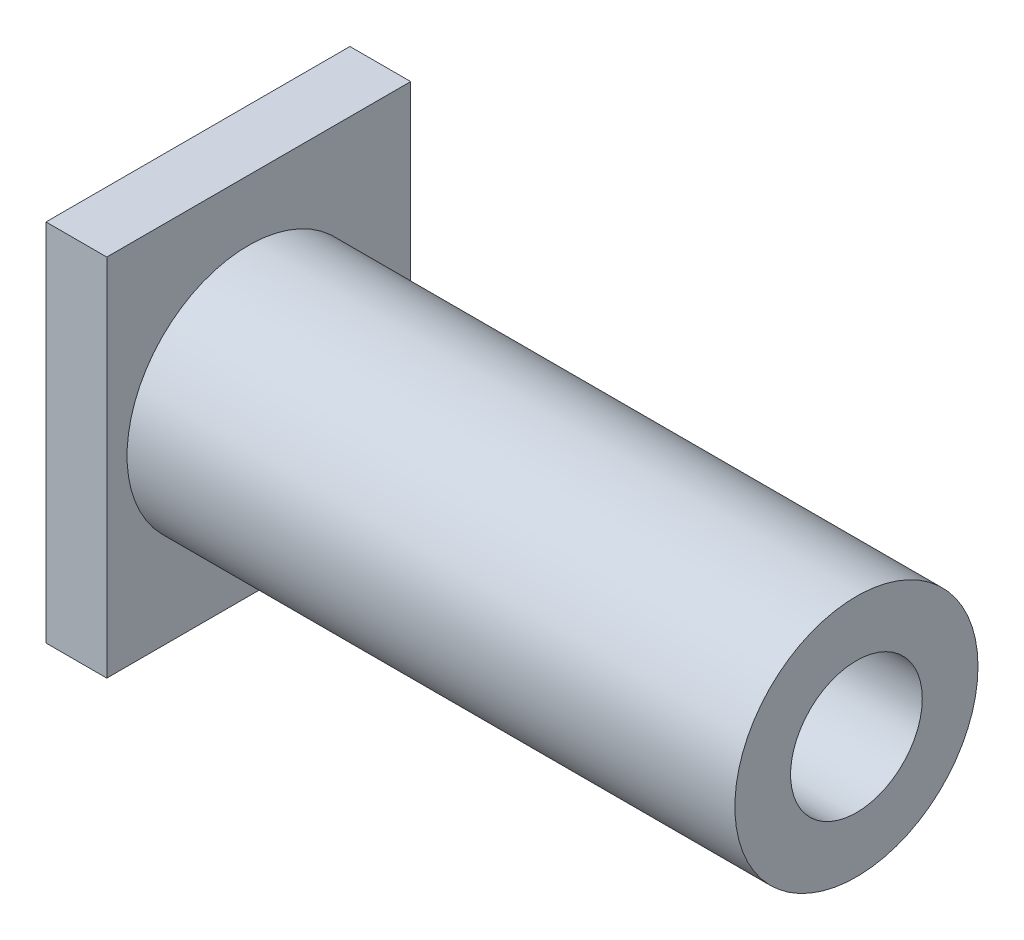
ISO-10303-21;
HEADER;
FILE_DESCRIPTION(('STEP AP214'),'2;1');
FILE_NAME('part.step','',(''),(''),'','','');
FILE_SCHEMA(('AUTOMOTIVE_DESIGN { 1 0 10303 214 1 1 1 1 }'));
ENDSEC;
DATA;
#1=APPLICATION_CONTEXT('core data for automotive mechanical design processes');
#2=APPLICATION_PROTOCOL_DEFINITION('international standard','automotive_design',2000,#1);
#3=PRODUCT_CONTEXT('',#1,'mechanical');
#4=PRODUCT('Part','Part','',(#3));
#5=PRODUCT_RELATED_PRODUCT_CATEGORY('part','',(#4));
#6=PRODUCT_DEFINITION_FORMATION('','',#4);
#7=PRODUCT_DEFINITION_CONTEXT('part definition',#1,'design');
#8=PRODUCT_DEFINITION('design','',#6,#7);
#9=PRODUCT_DEFINITION_SHAPE('','',#8);
#10=(LENGTH_UNIT() NAMED_UNIT(*) SI_UNIT(.MILLI.,.METRE.));
#11=(NAMED_UNIT(*) PLANE_ANGLE_UNIT() SI_UNIT($,.RADIAN.));
#12=(NAMED_UNIT(*) SI_UNIT($,.STERADIAN.) SOLID_ANGLE_UNIT());
#13=UNCERTAINTY_MEASURE_WITH_UNIT(LENGTH_MEASURE(1.E-05),#10,'distance_accuracy_value','');
#14=(GEOMETRIC_REPRESENTATION_CONTEXT(3) GLOBAL_UNCERTAINTY_ASSIGNED_CONTEXT((#13)) GLOBAL_UNIT_ASSIGNED_CONTEXT((#10,
#11,#12)) REPRESENTATION_CONTEXT('',''));
#15=CARTESIAN_POINT('',(0.,0.,0.));
#16=DIRECTION('',(0.,0.,1.));
#17=DIRECTION('',(1.,0.,0.));
#18=AXIS2_PLACEMENT_3D('',#15,#16,#17);
#19=CARTESIAN_POINT('',(3.,0.,0.));
#20=DIRECTION('',(1.,0.,0.));
#21=DIRECTION('',(0.,0.,-1.));
#22=AXIS2_PLACEMENT_3D('',#19,#20,#21);
#23=PLANE('',#22);
#24=DIRECTION('',(0.,0.,-1.));
#25=VECTOR('',#24,1.);
#26=CARTESIAN_POINT('',(3.,-6.33717296429137,8.68878917627916));
#27=LINE('',#26,#25);
#28=CARTESIAN_POINT('',(3.,-6.33717296429137,8.68878917627916));
#29=VERTEX_POINT('',#28);
#30=CARTESIAN_POINT('',(3.,-6.33717296429136,-6.31121082372084));
#31=VERTEX_POINT('',#30);
#32=EDGE_CURVE('E98',#29,#31,#27,.T.);
#33=ORIENTED_EDGE('',*,*,#32,.T.);
#34=DIRECTION('',(0.,1.,0.));
#35=VECTOR('',#34,1.);
#36=CARTESIAN_POINT('',(3.,-6.33717296429136,-6.31121082372084));
#37=LINE('',#36,#35);
#38=CARTESIAN_POINT('',(3.,11.6628270357086,-6.31121082372084));
#39=VERTEX_POINT('',#38);
#40=EDGE_CURVE('E93',#31,#39,#37,.T.);
#41=ORIENTED_EDGE('',*,*,#40,.T.);
#42=DIRECTION('',(0.,0.,1.));
#43=VECTOR('',#42,1.);
#44=CARTESIAN_POINT('',(3.,11.6628270357086,8.68878917627916));
#45=LINE('',#44,#43);
#46=CARTESIAN_POINT('',(3.,11.6628270357086,8.68878917627916));
#47=VERTEX_POINT('',#46);
#48=EDGE_CURVE('E96',#39,#47,#45,.T.);
#49=ORIENTED_EDGE('',*,*,#48,.T.);
#50=DIRECTION('',(0.,-1.,0.));
#51=VECTOR('',#50,1.);
#52=CARTESIAN_POINT('',(3.,-6.33717296429137,8.68878917627916));
#53=LINE('',#52,#51);
#54=EDGE_CURVE('E63',#47,#29,#53,.T.);
#55=ORIENTED_EDGE('',*,*,#54,.T.);
#56=EDGE_LOOP('',(#33,#41,#49,#55));
#57=FACE_BOUND('',#56,.T.);
#58=CARTESIAN_POINT('',(3.,2.66282703570863,1.68878917627916));
#59=DIRECTION('',(1.,0.,0.));
#60=DIRECTION('',(0.,0.,-1.));
#61=AXIS2_PLACEMENT_3D('',#58,#59,#60);
#62=CIRCLE('',#61,6.);
#63=CARTESIAN_POINT('',(3.,2.66282703570863,-4.31121082372084));
#64=VERTEX_POINT('',#63);
#65=EDGE_CURVE('E140',#64,#64,#62,.T.);
#66=ORIENTED_EDGE('',*,*,#65,.F.);
#67=EDGE_LOOP('',(#66));
#68=FACE_BOUND('',#67,.T.);
#69=ADVANCED_FACE('F45',(#57,#68),#23,.T.);
#70=CARTESIAN_POINT('',(0.,0.,0.));
#71=DIRECTION('',(1.,0.,0.));
#72=DIRECTION('',(0.,0.,-1.));
#73=AXIS2_PLACEMENT_3D('',#70,#71,#72);
#74=PLANE('',#73);
#75=DIRECTION('',(0.,0.,-1.));
#76=VECTOR('',#75,1.);
#77=CARTESIAN_POINT('',(0.,-6.33717296429137,8.68878917627916));
#78=LINE('',#77,#76);
#79=CARTESIAN_POINT('',(0.,-6.33717296429137,8.68878917627916));
#80=VERTEX_POINT('',#79);
#81=CARTESIAN_POINT('',(0.,-6.33717296429136,-6.31121082372084));
#82=VERTEX_POINT('',#81);
#83=EDGE_CURVE('E114',#80,#82,#78,.T.);
#84=ORIENTED_EDGE('',*,*,#83,.F.);
#85=DIRECTION('',(0.,-1.,0.));
#86=VECTOR('',#85,1.);
#87=CARTESIAN_POINT('',(0.,-6.33717296429137,8.68878917627916));
#88=LINE('',#87,#86);
#89=CARTESIAN_POINT('',(0.,11.6628270357086,8.68878917627916));
#90=VERTEX_POINT('',#89);
#91=EDGE_CURVE('E86',#90,#80,#88,.T.);
#92=ORIENTED_EDGE('',*,*,#91,.F.);
#93=DIRECTION('',(0.,0.,1.));
#94=VECTOR('',#93,1.);
#95=CARTESIAN_POINT('',(0.,11.6628270357086,8.68878917627916));
#96=LINE('',#95,#94);
#97=CARTESIAN_POINT('',(0.,11.6628270357086,-6.31121082372084));
#98=VERTEX_POINT('',#97);
#99=EDGE_CURVE('E80',#98,#90,#96,.T.);
#100=ORIENTED_EDGE('',*,*,#99,.F.);
#101=DIRECTION('',(0.,1.,0.));
#102=VECTOR('',#101,1.);
#103=CARTESIAN_POINT('',(0.,-6.33717296429136,-6.31121082372084));
#104=LINE('',#103,#102);
#105=EDGE_CURVE('E103',#82,#98,#104,.T.);
#106=ORIENTED_EDGE('',*,*,#105,.F.);
#107=EDGE_LOOP('',(#84,#92,#100,#106));
#108=FACE_BOUND('',#107,.T.);
#109=CARTESIAN_POINT('',(0.,2.66282703570863,1.68878917627916));
#110=DIRECTION('',(1.,0.,0.));
#111=DIRECTION('',(0.,0.,-1.));
#112=AXIS2_PLACEMENT_3D('',#109,#110,#111);
#113=CIRCLE('',#112,3.25);
#114=CARTESIAN_POINT('',(0.,2.66282703570863,-1.56121082372084));
#115=VERTEX_POINT('',#114);
#116=EDGE_CURVE('E118',#115,#115,#113,.T.);
#117=ORIENTED_EDGE('',*,*,#116,.T.);
#118=EDGE_LOOP('',(#117));
#119=FACE_BOUND('',#118,.T.);
#120=ADVANCED_FACE('F131',(#108,#119),#74,.F.);
#121=CARTESIAN_POINT('',(3.,-6.33717296429137,8.68878917627916));
#122=DIRECTION('',(0.,1.,0.));
#123=DIRECTION('',(0.,0.,1.));
#124=AXIS2_PLACEMENT_3D('',#121,#122,#123);
#125=PLANE('',#124);
#126=ORIENTED_EDGE('',*,*,#83,.T.);
#127=DIRECTION('',(-1.,0.,0.));
#128=VECTOR('',#127,1.);
#129=CARTESIAN_POINT('',(3.,-6.33717296429136,-6.31121082372084));
#130=LINE('',#129,#128);
#131=EDGE_CURVE('E11',#31,#82,#130,.T.);
#132=ORIENTED_EDGE('',*,*,#131,.F.);
#133=ORIENTED_EDGE('',*,*,#32,.F.);
#134=DIRECTION('',(-1.,0.,0.));
#135=VECTOR('',#134,1.);
#136=CARTESIAN_POINT('',(3.,-6.33717296429137,8.68878917627916));
#137=LINE('',#136,#135);
#138=EDGE_CURVE('E110',#29,#80,#137,.T.);
#139=ORIENTED_EDGE('',*,*,#138,.T.);
#140=EDGE_LOOP('',(#126,#132,#133,#139));
#141=FACE_BOUND('',#140,.T.);
#142=ADVANCED_FACE('F47',(#141),#125,.F.);
#143=CARTESIAN_POINT('',(3.,-6.33717296429136,-6.31121082372084));
#144=DIRECTION('',(0.,0.,1.));
#145=DIRECTION('',(1.,0.,0.));
#146=AXIS2_PLACEMENT_3D('',#143,#144,#145);
#147=PLANE('',#146);
#148=ORIENTED_EDGE('',*,*,#105,.T.);
#149=DIRECTION('',(-1.,0.,0.));
#150=VECTOR('',#149,1.);
#151=CARTESIAN_POINT('',(3.,11.6628270357086,-6.31121082372084));
#152=LINE('',#151,#150);
#153=EDGE_CURVE('E55',#39,#98,#152,.T.);
#154=ORIENTED_EDGE('',*,*,#153,.F.);
#155=ORIENTED_EDGE('',*,*,#40,.F.);
#156=ORIENTED_EDGE('',*,*,#131,.T.);
#157=EDGE_LOOP('',(#148,#154,#155,#156));
#158=FACE_BOUND('',#157,.T.);
#159=ADVANCED_FACE('F102',(#158),#147,.F.);
#160=CARTESIAN_POINT('',(3.,11.6628270357086,8.68878917627916));
#161=DIRECTION('',(0.,-1.,0.));
#162=DIRECTION('',(0.,0.,-1.));
#163=AXIS2_PLACEMENT_3D('',#160,#161,#162);
#164=PLANE('',#163);
#165=ORIENTED_EDGE('',*,*,#99,.T.);
#166=DIRECTION('',(-1.,0.,0.));
#167=VECTOR('',#166,1.);
#168=CARTESIAN_POINT('',(3.,11.6628270357086,8.68878917627916));
#169=LINE('',#168,#167);
#170=EDGE_CURVE('E105',#47,#90,#169,.T.);
#171=ORIENTED_EDGE('',*,*,#170,.F.);
#172=ORIENTED_EDGE('',*,*,#48,.F.);
#173=ORIENTED_EDGE('',*,*,#153,.T.);
#174=EDGE_LOOP('',(#165,#171,#172,#173));
#175=FACE_BOUND('',#174,.T.);
#176=ADVANCED_FACE('F106',(#175),#164,.F.);
#177=CARTESIAN_POINT('',(3.,-6.33717296429137,8.68878917627916));
#178=DIRECTION('',(0.,0.,-1.));
#179=DIRECTION('',(-1.,0.,0.));
#180=AXIS2_PLACEMENT_3D('',#177,#178,#179);
#181=PLANE('',#180);
#182=ORIENTED_EDGE('',*,*,#91,.T.);
#183=ORIENTED_EDGE('',*,*,#138,.F.);
#184=ORIENTED_EDGE('',*,*,#54,.F.);
#185=ORIENTED_EDGE('',*,*,#170,.T.);
#186=EDGE_LOOP('',(#182,#183,#184,#185));
#187=FACE_BOUND('',#186,.T.);
#188=ADVANCED_FACE('F128',(#187),#181,.F.);
#189=CARTESIAN_POINT('',(3.,2.66282703570863,1.68878917627916));
#190=DIRECTION('',(-1.,0.,0.));
#191=DIRECTION('',(0.,0.,1.));
#192=AXIS2_PLACEMENT_3D('',#189,#190,#191);
#193=CYLINDRICAL_SURFACE('',#192,3.25);
#194=ORIENTED_EDGE('',*,*,#116,.F.);
#195=EDGE_LOOP('',(#194));
#196=FACE_BOUND('',#195,.T.);
#197=CARTESIAN_POINT('',(33.,2.66282703570863,1.68878917627916));
#198=DIRECTION('',(1.,0.,0.));
#199=DIRECTION('',(0.,0.,-1.));
#200=AXIS2_PLACEMENT_3D('',#197,#198,#199);
#201=CIRCLE('',#200,3.25);
#202=CARTESIAN_POINT('',(33.,2.66282703570863,-1.56121082372084));
#203=VERTEX_POINT('',#202);
#204=EDGE_CURVE('E144',#203,#203,#201,.T.);
#205=ORIENTED_EDGE('',*,*,#204,.T.);
#206=EDGE_LOOP('',(#205));
#207=FACE_BOUND('',#206,.T.);
#208=ADVANCED_FACE('F152',(#196,#207),#193,.F.);
#209=CARTESIAN_POINT('',(33.,2.66282703570863,1.68878917627916));
#210=DIRECTION('',(1.,0.,0.));
#211=DIRECTION('',(0.,0.,-1.));
#212=AXIS2_PLACEMENT_3D('',#209,#210,#211);
#213=PLANE('',#212);
#214=CARTESIAN_POINT('',(33.,2.66282703570863,1.68878917627916));
#215=DIRECTION('',(1.,0.,0.));
#216=DIRECTION('',(0.,0.,-1.));
#217=AXIS2_PLACEMENT_3D('',#214,#215,#216);
#218=CIRCLE('',#217,6.);
#219=CARTESIAN_POINT('',(33.,2.66282703570863,-4.31121082372084));
#220=VERTEX_POINT('',#219);
#221=EDGE_CURVE('E139',#220,#220,#218,.T.);
#222=ORIENTED_EDGE('',*,*,#221,.T.);
#223=EDGE_LOOP('',(#222));
#224=FACE_BOUND('',#223,.T.);
#225=ORIENTED_EDGE('',*,*,#204,.F.);
#226=EDGE_LOOP('',(#225));
#227=FACE_BOUND('',#226,.T.);
#228=ADVANCED_FACE('F154',(#224,#227),#213,.T.);
#229=CARTESIAN_POINT('',(33.,2.66282703570863,1.68878917627916));
#230=DIRECTION('',(-1.,0.,0.));
#231=DIRECTION('',(0.,0.,1.));
#232=AXIS2_PLACEMENT_3D('',#229,#230,#231);
#233=CYLINDRICAL_SURFACE('',#232,6.);
#234=ORIENTED_EDGE('',*,*,#221,.F.);
#235=EDGE_LOOP('',(#234));
#236=FACE_BOUND('',#235,.T.);
#237=ORIENTED_EDGE('',*,*,#65,.T.);
#238=EDGE_LOOP('',(#237));
#239=FACE_BOUND('',#238,.T.);
#240=ADVANCED_FACE('F156',(#236,#239),#233,.T.);
#241=CLOSED_SHELL('',(#69,#120,#142,#159,#176,#188,#208,#228,#240));
#242=MANIFOLD_SOLID_BREP('B2',#241);
#243=ADVANCED_BREP_SHAPE_REPRESENTATION('',(#18,#242),#14);
#244=SHAPE_DEFINITION_REPRESENTATION(#9,#243);
ENDSEC;
END-ISO-10303-21;
